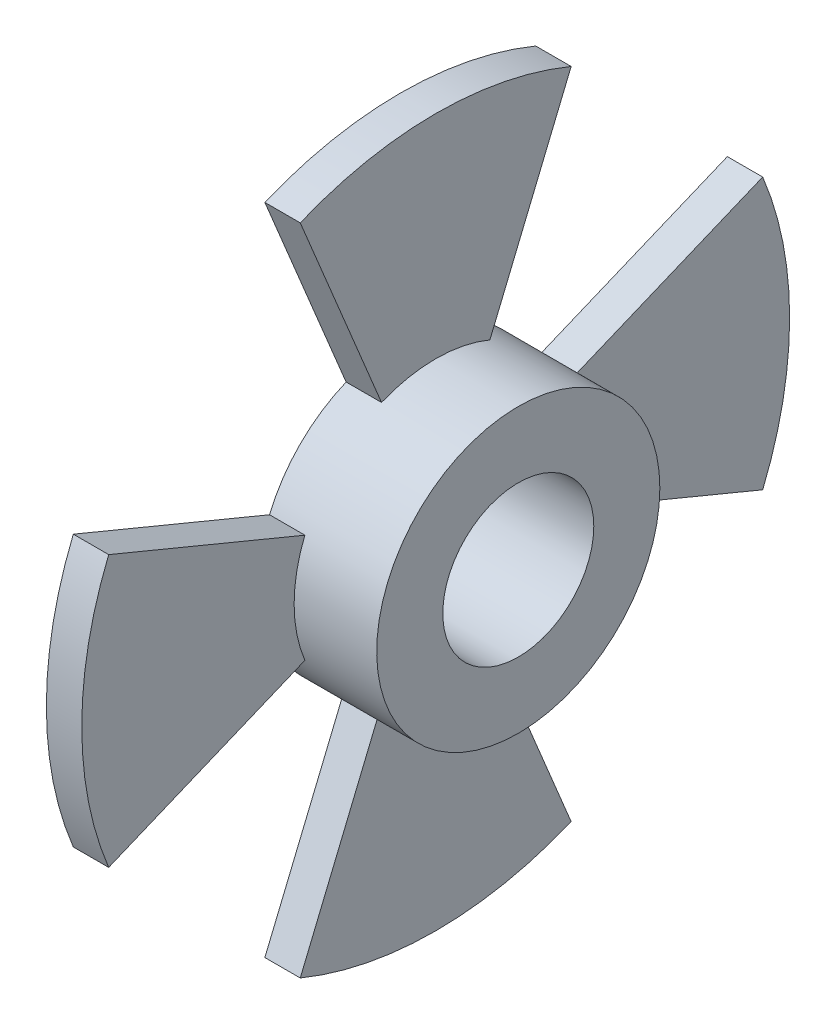
ISO-10303-21;
HEADER;
FILE_DESCRIPTION(('STEP AP214'),'2;1');
FILE_NAME('part.step','',(''),(''),'','','');
FILE_SCHEMA(('AUTOMOTIVE_DESIGN { 1 0 10303 214 1 1 1 1 }'));
ENDSEC;
DATA;
#1=APPLICATION_CONTEXT('core data for automotive mechanical design processes');
#2=APPLICATION_PROTOCOL_DEFINITION('international standard','automotive_design',2000,#1);
#3=PRODUCT_CONTEXT('',#1,'mechanical');
#4=PRODUCT('Part','Part','',(#3));
#5=PRODUCT_RELATED_PRODUCT_CATEGORY('part','',(#4));
#6=PRODUCT_DEFINITION_FORMATION('','',#4);
#7=PRODUCT_DEFINITION_CONTEXT('part definition',#1,'design');
#8=PRODUCT_DEFINITION('design','',#6,#7);
#9=PRODUCT_DEFINITION_SHAPE('','',#8);
#10=(LENGTH_UNIT() NAMED_UNIT(*) SI_UNIT(.MILLI.,.METRE.));
#11=(NAMED_UNIT(*) PLANE_ANGLE_UNIT() SI_UNIT($,.RADIAN.));
#12=(NAMED_UNIT(*) SI_UNIT($,.STERADIAN.) SOLID_ANGLE_UNIT());
#13=UNCERTAINTY_MEASURE_WITH_UNIT(LENGTH_MEASURE(1.E-05),#10,'distance_accuracy_value','');
#14=(GEOMETRIC_REPRESENTATION_CONTEXT(3) GLOBAL_UNCERTAINTY_ASSIGNED_CONTEXT((#13)) GLOBAL_UNIT_ASSIGNED_CONTEXT((#10,
#11,#12)) REPRESENTATION_CONTEXT('',''));
#15=CARTESIAN_POINT('',(0.,0.,0.));
#16=DIRECTION('',(0.,0.,1.));
#17=DIRECTION('',(1.,0.,0.));
#18=AXIS2_PLACEMENT_3D('',#15,#16,#17);
#19=CARTESIAN_POINT('',(0.75,0.,0.));
#20=DIRECTION('',(1.,0.,0.));
#21=DIRECTION('',(0.,0.,-1.));
#22=AXIS2_PLACEMENT_3D('',#19,#20,#21);
#23=PLANE('',#22);
#24=CARTESIAN_POINT('',(0.75,0.,0.));
#25=DIRECTION('',(1.,0.,0.));
#26=DIRECTION('',(0.,0.,-1.));
#27=AXIS2_PLACEMENT_3D('',#24,#25,#26);
#28=CIRCLE('',#27,6.);
#29=CARTESIAN_POINT('',(0.75,5.54327719506774,-2.2961005941905));
#30=VERTEX_POINT('',#29);
#31=CARTESIAN_POINT('',(0.75,5.54327719506771,2.29610059419058));
#32=VERTEX_POINT('',#31);
#33=EDGE_CURVE('E11',#30,#32,#28,.T.);
#34=ORIENTED_EDGE('',*,*,#33,.F.);
#35=DIRECTION('',(0.,-0.923879532511289,0.382683432365084));
#36=VECTOR('',#35,1.);
#37=CARTESIAN_POINT('',(0.75,0.,0.));
#38=LINE('',#37,#36);
#39=CARTESIAN_POINT('',(0.75,13.8581929876693,-5.74025148547626));
#40=VERTEX_POINT('',#39);
#41=EDGE_CURVE('E198',#40,#30,#38,.T.);
#42=ORIENTED_EDGE('',*,*,#41,.F.);
#43=CARTESIAN_POINT('',(0.75,0.,0.));
#44=DIRECTION('',(1.,0.,0.));
#45=DIRECTION('',(0.,0.,-1.));
#46=AXIS2_PLACEMENT_3D('',#43,#44,#45);
#47=CIRCLE('',#46,15.);
#48=CARTESIAN_POINT('',(0.75,13.8581929876693,5.74025148547644));
#49=VERTEX_POINT('',#48);
#50=EDGE_CURVE('E201',#40,#49,#47,.T.);
#51=ORIENTED_EDGE('',*,*,#50,.T.);
#52=DIRECTION('',(0.,-0.923879532511284,-0.382683432365096));
#53=VECTOR('',#52,1.);
#54=CARTESIAN_POINT('',(0.75,0.,0.));
#55=LINE('',#54,#53);
#56=EDGE_CURVE('E203',#49,#32,#55,.T.);
#57=ORIENTED_EDGE('',*,*,#56,.T.);
#58=EDGE_LOOP('',(#34,#42,#51,#57));
#59=FACE_BOUND('',#58,.T.);
#60=ADVANCED_FACE('F37',(#59),#23,.T.);
#61=CARTESIAN_POINT('',(0.75,2.2961005941905,5.54327719506774));
#62=VERTEX_POINT('',#61);
#63=CARTESIAN_POINT('',(0.75,-2.29610059419058,5.54327719506771));
#64=VERTEX_POINT('',#63);
#65=EDGE_CURVE('E47',#62,#64,#28,.T.);
#66=ORIENTED_EDGE('',*,*,#65,.F.);
#67=DIRECTION('',(0.,-0.382683432365084,-0.923879532511289));
#68=VECTOR('',#67,1.);
#69=CARTESIAN_POINT('',(0.75,0.,0.));
#70=LINE('',#69,#68);
#71=CARTESIAN_POINT('',(0.75,5.74025148547625,13.8581929876693));
#72=VERTEX_POINT('',#71);
#73=EDGE_CURVE('E205',#72,#62,#70,.T.);
#74=ORIENTED_EDGE('',*,*,#73,.F.);
#75=CARTESIAN_POINT('',(0.75,0.,0.));
#76=DIRECTION('',(1.,0.,0.));
#77=DIRECTION('',(0.,0.,-1.));
#78=AXIS2_PLACEMENT_3D('',#75,#76,#77);
#79=CIRCLE('',#78,15.);
#80=CARTESIAN_POINT('',(0.75,-5.74025148547644,13.8581929876693));
#81=VERTEX_POINT('',#80);
#82=EDGE_CURVE('E208',#72,#81,#79,.T.);
#83=ORIENTED_EDGE('',*,*,#82,.T.);
#84=DIRECTION('',(0.,0.382683432365096,-0.923879532511284));
#85=VECTOR('',#84,1.);
#86=CARTESIAN_POINT('',(0.75,0.,0.));
#87=LINE('',#86,#85);
#88=EDGE_CURVE('E210',#81,#64,#87,.T.);
#89=ORIENTED_EDGE('',*,*,#88,.T.);
#90=EDGE_LOOP('',(#66,#74,#83,#89));
#91=FACE_BOUND('',#90,.T.);
#92=ADVANCED_FACE('F297',(#91),#23,.T.);
#93=CARTESIAN_POINT('',(0.75,-5.54327719506774,2.2961005941905));
#94=VERTEX_POINT('',#93);
#95=CARTESIAN_POINT('',(0.75,-5.54327719506771,-2.29610059419058));
#96=VERTEX_POINT('',#95);
#97=EDGE_CURVE('E165',#94,#96,#28,.T.);
#98=ORIENTED_EDGE('',*,*,#97,.F.);
#99=DIRECTION('',(0.,0.923879532511289,-0.382683432365084));
#100=VECTOR('',#99,1.);
#101=CARTESIAN_POINT('',(0.75,0.,0.));
#102=LINE('',#101,#100);
#103=CARTESIAN_POINT('',(0.75,-13.8581929876693,5.74025148547626));
#104=VERTEX_POINT('',#103);
#105=EDGE_CURVE('E212',#104,#94,#102,.T.);
#106=ORIENTED_EDGE('',*,*,#105,.F.);
#107=CARTESIAN_POINT('',(0.75,0.,0.));
#108=DIRECTION('',(1.,0.,0.));
#109=DIRECTION('',(0.,0.,-1.));
#110=AXIS2_PLACEMENT_3D('',#107,#108,#109);
#111=CIRCLE('',#110,15.);
#112=CARTESIAN_POINT('',(0.75,-13.8581929876693,-5.74025148547644));
#113=VERTEX_POINT('',#112);
#114=EDGE_CURVE('E168',#104,#113,#111,.T.);
#115=ORIENTED_EDGE('',*,*,#114,.T.);
#116=DIRECTION('',(0.,0.923879532511284,0.382683432365096));
#117=VECTOR('',#116,1.);
#118=CARTESIAN_POINT('',(0.75,0.,0.));
#119=LINE('',#118,#117);
#120=EDGE_CURVE('E160',#113,#96,#119,.T.);
#121=ORIENTED_EDGE('',*,*,#120,.T.);
#122=EDGE_LOOP('',(#98,#106,#115,#121));
#123=FACE_BOUND('',#122,.T.);
#124=ADVANCED_FACE('F162',(#123),#23,.T.);
#125=CARTESIAN_POINT('',(0.75,0.,0.));
#126=DIRECTION('',(-1.,0.,0.));
#127=DIRECTION('',(0.,0.,1.));
#128=AXIS2_PLACEMENT_3D('',#125,#126,#127);
#129=CYLINDRICAL_SURFACE('',#128,15.);
#130=CARTESIAN_POINT('',(-0.75,0.,0.));
#131=DIRECTION('',(1.,0.,0.));
#132=DIRECTION('',(0.,0.,-1.));
#133=AXIS2_PLACEMENT_3D('',#130,#131,#132);
#134=CIRCLE('',#133,15.);
#135=CARTESIAN_POINT('',(-0.75,-5.74025148547626,-13.8581929876693));
#136=VERTEX_POINT('',#135);
#137=CARTESIAN_POINT('',(-0.75,5.74025148547644,-13.8581929876693));
#138=VERTEX_POINT('',#137);
#139=EDGE_CURVE('E216',#136,#138,#134,.T.);
#140=ORIENTED_EDGE('',*,*,#139,.T.);
#141=DIRECTION('',(-1.,0.,0.));
#142=VECTOR('',#141,1.);
#143=CARTESIAN_POINT('',(0.75,5.74025148547644,-13.8581929876693));
#144=LINE('',#143,#142);
#145=CARTESIAN_POINT('',(0.75,5.74025148547644,-13.8581929876693));
#146=VERTEX_POINT('',#145);
#147=EDGE_CURVE('E41',#146,#138,#144,.T.);
#148=ORIENTED_EDGE('',*,*,#147,.F.);
#149=CARTESIAN_POINT('',(0.75,0.,0.));
#150=DIRECTION('',(1.,0.,0.));
#151=DIRECTION('',(0.,0.,-1.));
#152=AXIS2_PLACEMENT_3D('',#149,#150,#151);
#153=CIRCLE('',#152,15.);
#154=CARTESIAN_POINT('',(0.75,-5.74025148547626,-13.8581929876693));
#155=VERTEX_POINT('',#154);
#156=EDGE_CURVE('E194',#155,#146,#153,.T.);
#157=ORIENTED_EDGE('',*,*,#156,.F.);
#158=DIRECTION('',(-1.,0.,0.));
#159=VECTOR('',#158,1.);
#160=CARTESIAN_POINT('',(0.75,-5.74025148547626,-13.8581929876693));
#161=LINE('',#160,#159);
#162=EDGE_CURVE('E57',#155,#136,#161,.T.);
#163=ORIENTED_EDGE('',*,*,#162,.T.);
#164=EDGE_LOOP('',(#140,#148,#157,#163));
#165=FACE_BOUND('',#164,.T.);
#166=ADVANCED_FACE('F39',(#165),#129,.T.);
#167=CARTESIAN_POINT('',(0.75,0.,0.));
#168=DIRECTION('',(0.,-0.923879532511284,-0.382683432365096));
#169=DIRECTION('',(0.,0.382683432365096,-0.923879532511285));
#170=AXIS2_PLACEMENT_3D('',#167,#168,#169);
#171=PLANE('',#170);
#172=DIRECTION('',(0.,-0.382683432365096,0.923879532511284));
#173=VECTOR('',#172,1.);
#174=CARTESIAN_POINT('',(-0.75,0.,0.));
#175=LINE('',#174,#173);
#176=CARTESIAN_POINT('',(-0.75,2.29610059419058,-5.54327719506771));
#177=VERTEX_POINT('',#176);
#178=EDGE_CURVE('E218',#138,#177,#175,.T.);
#179=ORIENTED_EDGE('',*,*,#178,.T.);
#180=DIRECTION('',(-1.,0.,0.));
#181=VECTOR('',#180,1.);
#182=CARTESIAN_POINT('',(0.75,2.29610059419058,-5.54327719506771));
#183=LINE('',#182,#181);
#184=CARTESIAN_POINT('',(0.75,2.29610059419058,-5.54327719506771));
#185=VERTEX_POINT('',#184);
#186=EDGE_CURVE('E276',#185,#177,#183,.T.);
#187=ORIENTED_EDGE('',*,*,#186,.F.);
#188=DIRECTION('',(0.,-0.382683432365096,0.923879532511284));
#189=VECTOR('',#188,1.);
#190=CARTESIAN_POINT('',(0.75,0.,0.));
#191=LINE('',#190,#189);
#192=EDGE_CURVE('E122',#146,#185,#191,.T.);
#193=ORIENTED_EDGE('',*,*,#192,.F.);
#194=ORIENTED_EDGE('',*,*,#147,.T.);
#195=EDGE_LOOP('',(#179,#187,#193,#194));
#196=FACE_BOUND('',#195,.T.);
#197=ADVANCED_FACE('F280',(#196),#171,.F.);
#198=CARTESIAN_POINT('',(0.75,0.,0.));
#199=DIRECTION('',(0.,-0.382683432365084,-0.923879532511289));
#200=DIRECTION('',(0.,0.923879532511289,-0.382683432365084));
#201=AXIS2_PLACEMENT_3D('',#198,#199,#200);
#202=PLANE('',#201);
#203=DIRECTION('',(0.,-0.923879532511289,0.382683432365084));
#204=VECTOR('',#203,1.);
#205=CARTESIAN_POINT('',(-0.75,0.,0.));
#206=LINE('',#205,#204);
#207=CARTESIAN_POINT('',(-0.75,13.8581929876693,-5.74025148547626));
#208=VERTEX_POINT('',#207);
#209=CARTESIAN_POINT('',(-0.75,5.54327719506774,-2.2961005941905));
#210=VERTEX_POINT('',#209);
#211=EDGE_CURVE('E223',#208,#210,#206,.T.);
#212=ORIENTED_EDGE('',*,*,#211,.F.);
#213=DIRECTION('',(-1.,0.,0.));
#214=VECTOR('',#213,1.);
#215=CARTESIAN_POINT('',(0.75,13.8581929876693,-5.74025148547626));
#216=LINE('',#215,#214);
#217=EDGE_CURVE('E273',#40,#208,#216,.T.);
#218=ORIENTED_EDGE('',*,*,#217,.F.);
#219=ORIENTED_EDGE('',*,*,#41,.T.);
#220=DIRECTION('',(-1.,0.,0.));
#221=VECTOR('',#220,1.);
#222=CARTESIAN_POINT('',(0.75,5.54327719506774,-2.2961005941905));
#223=LINE('',#222,#221);
#224=EDGE_CURVE('E275',#30,#210,#223,.T.);
#225=ORIENTED_EDGE('',*,*,#224,.T.);
#226=EDGE_LOOP('',(#212,#218,#219,#225));
#227=FACE_BOUND('',#226,.T.);
#228=ADVANCED_FACE('F319',(#227),#202,.T.);
#229=CARTESIAN_POINT('',(0.75,0.,0.));
#230=DIRECTION('',(-1.,0.,0.));
#231=DIRECTION('',(0.,0.,1.));
#232=AXIS2_PLACEMENT_3D('',#229,#230,#231);
#233=CYLINDRICAL_SURFACE('',#232,15.);
#234=CARTESIAN_POINT('',(-0.75,0.,0.));
#235=DIRECTION('',(1.,0.,0.));
#236=DIRECTION('',(0.,0.,-1.));
#237=AXIS2_PLACEMENT_3D('',#234,#235,#236);
#238=CIRCLE('',#237,15.);
#239=CARTESIAN_POINT('',(-0.75,13.8581929876693,5.74025148547644));
#240=VERTEX_POINT('',#239);
#241=EDGE_CURVE('E228',#208,#240,#238,.T.);
#242=ORIENTED_EDGE('',*,*,#241,.T.);
#243=DIRECTION('',(-1.,0.,0.));
#244=VECTOR('',#243,1.);
#245=CARTESIAN_POINT('',(0.75,13.8581929876693,5.74025148547644));
#246=LINE('',#245,#244);
#247=EDGE_CURVE('E270',#49,#240,#246,.T.);
#248=ORIENTED_EDGE('',*,*,#247,.F.);
#249=ORIENTED_EDGE('',*,*,#50,.F.);
#250=ORIENTED_EDGE('',*,*,#217,.T.);
#251=EDGE_LOOP('',(#242,#248,#249,#250));
#252=FACE_BOUND('',#251,.T.);
#253=ADVANCED_FACE('F323',(#252),#233,.T.);
#254=CARTESIAN_POINT('',(0.75,0.,0.));
#255=DIRECTION('',(0.,0.382683432365096,-0.923879532511284));
#256=DIRECTION('',(0.,0.923879532511284,0.382683432365096));
#257=AXIS2_PLACEMENT_3D('',#254,#255,#256);
#258=PLANE('',#257);
#259=DIRECTION('',(0.,-0.923879532511284,-0.382683432365096));
#260=VECTOR('',#259,1.);
#261=CARTESIAN_POINT('',(-0.75,0.,0.));
#262=LINE('',#261,#260);
#263=CARTESIAN_POINT('',(-0.75,5.54327719506771,2.29610059419058));
#264=VERTEX_POINT('',#263);
#265=EDGE_CURVE('E230',#240,#264,#262,.T.);
#266=ORIENTED_EDGE('',*,*,#265,.T.);
#267=DIRECTION('',(-1.,0.,0.));
#268=VECTOR('',#267,1.);
#269=CARTESIAN_POINT('',(0.75,5.54327719506771,2.29610059419058));
#270=LINE('',#269,#268);
#271=EDGE_CURVE('E267',#32,#264,#270,.T.);
#272=ORIENTED_EDGE('',*,*,#271,.F.);
#273=ORIENTED_EDGE('',*,*,#56,.F.);
#274=ORIENTED_EDGE('',*,*,#247,.T.);
#275=EDGE_LOOP('',(#266,#272,#273,#274));
#276=FACE_BOUND('',#275,.T.);
#277=ADVANCED_FACE('F329',(#276),#258,.F.);
#278=CARTESIAN_POINT('',(0.75,0.,0.));
#279=DIRECTION('',(0.,0.923879532511289,-0.382683432365084));
#280=DIRECTION('',(0.,0.382683432365084,0.923879532511289));
#281=AXIS2_PLACEMENT_3D('',#278,#279,#280);
#282=PLANE('',#281);
#283=DIRECTION('',(0.,-0.382683432365084,-0.923879532511289));
#284=VECTOR('',#283,1.);
#285=CARTESIAN_POINT('',(-0.75,0.,0.));
#286=LINE('',#285,#284);
#287=CARTESIAN_POINT('',(-0.75,5.74025148547625,13.8581929876693));
#288=VERTEX_POINT('',#287);
#289=CARTESIAN_POINT('',(-0.75,2.2961005941905,5.54327719506774));
#290=VERTEX_POINT('',#289);
#291=EDGE_CURVE('E232',#288,#290,#286,.T.);
#292=ORIENTED_EDGE('',*,*,#291,.F.);
#293=DIRECTION('',(-1.,0.,0.));
#294=VECTOR('',#293,1.);
#295=CARTESIAN_POINT('',(0.75,5.74025148547625,13.8581929876693));
#296=LINE('',#295,#294);
#297=EDGE_CURVE('E263',#72,#288,#296,.T.);
#298=ORIENTED_EDGE('',*,*,#297,.F.);
#299=ORIENTED_EDGE('',*,*,#73,.T.);
#300=DIRECTION('',(-1.,0.,0.));
#301=VECTOR('',#300,1.);
#302=CARTESIAN_POINT('',(0.75,2.2961005941905,5.54327719506774));
#303=LINE('',#302,#301);
#304=EDGE_CURVE('E265',#62,#290,#303,.T.);
#305=ORIENTED_EDGE('',*,*,#304,.T.);
#306=EDGE_LOOP('',(#292,#298,#299,#305));
#307=FACE_BOUND('',#306,.T.);
#308=ADVANCED_FACE('F333',(#307),#282,.T.);
#309=CARTESIAN_POINT('',(0.75,0.,0.));
#310=DIRECTION('',(-1.,0.,0.));
#311=DIRECTION('',(0.,0.,1.));
#312=AXIS2_PLACEMENT_3D('',#309,#310,#311);
#313=CYLINDRICAL_SURFACE('',#312,15.);
#314=CARTESIAN_POINT('',(-0.75,0.,0.));
#315=DIRECTION('',(1.,0.,0.));
#316=DIRECTION('',(0.,0.,-1.));
#317=AXIS2_PLACEMENT_3D('',#314,#315,#316);
#318=CIRCLE('',#317,15.);
#319=CARTESIAN_POINT('',(-0.75,-5.74025148547644,13.8581929876693));
#320=VERTEX_POINT('',#319);
#321=EDGE_CURVE('E235',#288,#320,#318,.T.);
#322=ORIENTED_EDGE('',*,*,#321,.T.);
#323=DIRECTION('',(-1.,0.,0.));
#324=VECTOR('',#323,1.);
#325=CARTESIAN_POINT('',(0.75,-5.74025148547644,13.8581929876693));
#326=LINE('',#325,#324);
#327=EDGE_CURVE('E260',#81,#320,#326,.T.);
#328=ORIENTED_EDGE('',*,*,#327,.F.);
#329=ORIENTED_EDGE('',*,*,#82,.F.);
#330=ORIENTED_EDGE('',*,*,#297,.T.);
#331=EDGE_LOOP('',(#322,#328,#329,#330));
#332=FACE_BOUND('',#331,.T.);
#333=ADVANCED_FACE('F337',(#332),#313,.T.);
#334=CARTESIAN_POINT('',(0.75,0.,0.));
#335=DIRECTION('',(0.,0.923879532511284,0.382683432365096));
#336=DIRECTION('',(0.,-0.382683432365096,0.923879532511285));
#337=AXIS2_PLACEMENT_3D('',#334,#335,#336);
#338=PLANE('',#337);
#339=DIRECTION('',(0.,0.382683432365096,-0.923879532511284));
#340=VECTOR('',#339,1.);
#341=CARTESIAN_POINT('',(-0.75,0.,0.));
#342=LINE('',#341,#340);
#343=CARTESIAN_POINT('',(-0.75,-2.29610059419058,5.54327719506771));
#344=VERTEX_POINT('',#343);
#345=EDGE_CURVE('E237',#320,#344,#342,.T.);
#346=ORIENTED_EDGE('',*,*,#345,.T.);
#347=DIRECTION('',(-1.,0.,0.));
#348=VECTOR('',#347,1.);
#349=CARTESIAN_POINT('',(0.75,-2.29610059419058,5.54327719506771));
#350=LINE('',#349,#348);
#351=EDGE_CURVE('E257',#64,#344,#350,.T.);
#352=ORIENTED_EDGE('',*,*,#351,.F.);
#353=ORIENTED_EDGE('',*,*,#88,.F.);
#354=ORIENTED_EDGE('',*,*,#327,.T.);
#355=EDGE_LOOP('',(#346,#352,#353,#354));
#356=FACE_BOUND('',#355,.T.);
#357=ADVANCED_FACE('F341',(#356),#338,.F.);
#358=CARTESIAN_POINT('',(0.75,0.,0.));
#359=DIRECTION('',(0.,0.382683432365084,0.923879532511289));
#360=DIRECTION('',(0.,-0.923879532511289,0.382683432365084));
#361=AXIS2_PLACEMENT_3D('',#358,#359,#360);
#362=PLANE('',#361);
#363=DIRECTION('',(0.,0.923879532511289,-0.382683432365084));
#364=VECTOR('',#363,1.);
#365=CARTESIAN_POINT('',(-0.75,0.,0.));
#366=LINE('',#365,#364);
#367=CARTESIAN_POINT('',(-0.75,-13.8581929876693,5.74025148547626));
#368=VERTEX_POINT('',#367);
#369=CARTESIAN_POINT('',(-0.75,-5.54327719506774,2.2961005941905));
#370=VERTEX_POINT('',#369);
#371=EDGE_CURVE('E240',#368,#370,#366,.T.);
#372=ORIENTED_EDGE('',*,*,#371,.F.);
#373=DIRECTION('',(-1.,0.,0.));
#374=VECTOR('',#373,1.);
#375=CARTESIAN_POINT('',(0.75,-13.8581929876693,5.74025148547626));
#376=LINE('',#375,#374);
#377=EDGE_CURVE('E254',#104,#368,#376,.T.);
#378=ORIENTED_EDGE('',*,*,#377,.F.);
#379=ORIENTED_EDGE('',*,*,#105,.T.);
#380=DIRECTION('',(-1.,0.,0.));
#381=VECTOR('',#380,1.);
#382=CARTESIAN_POINT('',(0.75,-5.54327719506774,2.2961005941905));
#383=LINE('',#382,#381);
#384=EDGE_CURVE('E186',#94,#370,#383,.T.);
#385=ORIENTED_EDGE('',*,*,#384,.T.);
#386=EDGE_LOOP('',(#372,#378,#379,#385));
#387=FACE_BOUND('',#386,.T.);
#388=ADVANCED_FACE('F345',(#387),#362,.T.);
#389=CARTESIAN_POINT('',(0.75,0.,0.));
#390=DIRECTION('',(-1.,0.,0.));
#391=DIRECTION('',(0.,0.,1.));
#392=AXIS2_PLACEMENT_3D('',#389,#390,#391);
#393=CYLINDRICAL_SURFACE('',#392,15.);
#394=CARTESIAN_POINT('',(-0.75,0.,0.));
#395=DIRECTION('',(1.,0.,0.));
#396=DIRECTION('',(0.,0.,-1.));
#397=AXIS2_PLACEMENT_3D('',#394,#395,#396);
#398=CIRCLE('',#397,15.);
#399=CARTESIAN_POINT('',(-0.75,-13.8581929876693,-5.74025148547644));
#400=VERTEX_POINT('',#399);
#401=EDGE_CURVE('E243',#368,#400,#398,.T.);
#402=ORIENTED_EDGE('',*,*,#401,.T.);
#403=DIRECTION('',(-1.,0.,0.));
#404=VECTOR('',#403,1.);
#405=CARTESIAN_POINT('',(0.75,-13.8581929876693,-5.74025148547644));
#406=LINE('',#405,#404);
#407=EDGE_CURVE('E181',#113,#400,#406,.T.);
#408=ORIENTED_EDGE('',*,*,#407,.F.);
#409=ORIENTED_EDGE('',*,*,#114,.F.);
#410=ORIENTED_EDGE('',*,*,#377,.T.);
#411=EDGE_LOOP('',(#402,#408,#409,#410));
#412=FACE_BOUND('',#411,.T.);
#413=ADVANCED_FACE('F349',(#412),#393,.T.);
#414=CARTESIAN_POINT('',(0.75,0.,0.));
#415=DIRECTION('',(0.,-0.382683432365096,0.923879532511284));
#416=DIRECTION('',(0.,-0.923879532511285,-0.382683432365096));
#417=AXIS2_PLACEMENT_3D('',#414,#415,#416);
#418=PLANE('',#417);
#419=DIRECTION('',(0.,0.923879532511284,0.382683432365096));
#420=VECTOR('',#419,1.);
#421=CARTESIAN_POINT('',(-0.75,0.,0.));
#422=LINE('',#421,#420);
#423=CARTESIAN_POINT('',(-0.75,-5.54327719506771,-2.29610059419058));
#424=VERTEX_POINT('',#423);
#425=EDGE_CURVE('E178',#400,#424,#422,.T.);
#426=ORIENTED_EDGE('',*,*,#425,.T.);
#427=DIRECTION('',(-1.,0.,0.));
#428=VECTOR('',#427,1.);
#429=CARTESIAN_POINT('',(0.75,-5.54327719506771,-2.29610059419058));
#430=LINE('',#429,#428);
#431=EDGE_CURVE('E175',#96,#424,#430,.T.);
#432=ORIENTED_EDGE('',*,*,#431,.F.);
#433=ORIENTED_EDGE('',*,*,#120,.F.);
#434=ORIENTED_EDGE('',*,*,#407,.T.);
#435=EDGE_LOOP('',(#426,#432,#433,#434));
#436=FACE_BOUND('',#435,.T.);
#437=ADVANCED_FACE('F176',(#436),#418,.F.);
#438=CARTESIAN_POINT('',(0.75,0.,0.));
#439=DIRECTION('',(-1.,0.,0.));
#440=DIRECTION('',(0.,0.,1.));
#441=AXIS2_PLACEMENT_3D('',#438,#439,#440);
#442=CYLINDRICAL_SURFACE('',#441,6.);
#443=CARTESIAN_POINT('',(-0.75,0.,0.));
#444=DIRECTION('',(1.,0.,0.));
#445=DIRECTION('',(0.,0.,-1.));
#446=AXIS2_PLACEMENT_3D('',#443,#444,#445);
#447=CIRCLE('',#446,6.);
#448=CARTESIAN_POINT('',(-0.75,-2.2961005941905,-5.54327719506774));
#449=VERTEX_POINT('',#448);
#450=EDGE_CURVE('E224',#424,#449,#447,.T.);
#451=ORIENTED_EDGE('',*,*,#450,.T.);
#452=DIRECTION('',(-1.,0.,0.));
#453=VECTOR('',#452,1.);
#454=CARTESIAN_POINT('',(0.75,-2.2961005941905,-5.54327719506774));
#455=LINE('',#454,#453);
#456=CARTESIAN_POINT('',(0.75,-2.2961005941905,-5.54327719506774));
#457=VERTEX_POINT('',#456);
#458=EDGE_CURVE('E109',#457,#449,#455,.T.);
#459=ORIENTED_EDGE('',*,*,#458,.F.);
#460=EDGE_CURVE('E49',#457,#185,#28,.T.);
#461=ORIENTED_EDGE('',*,*,#460,.T.);
#462=ORIENTED_EDGE('',*,*,#186,.T.);
#463=EDGE_CURVE('E220',#177,#210,#447,.T.);
#464=ORIENTED_EDGE('',*,*,#463,.T.);
#465=ORIENTED_EDGE('',*,*,#224,.F.);
#466=ORIENTED_EDGE('',*,*,#33,.T.);
#467=ORIENTED_EDGE('',*,*,#271,.T.);
#468=EDGE_CURVE('E225',#264,#290,#447,.T.);
#469=ORIENTED_EDGE('',*,*,#468,.T.);
#470=ORIENTED_EDGE('',*,*,#304,.F.);
#471=ORIENTED_EDGE('',*,*,#65,.T.);
#472=ORIENTED_EDGE('',*,*,#351,.T.);
#473=EDGE_CURVE('E239',#344,#370,#447,.T.);
#474=ORIENTED_EDGE('',*,*,#473,.T.);
#475=ORIENTED_EDGE('',*,*,#384,.F.);
#476=ORIENTED_EDGE('',*,*,#97,.T.);
#477=ORIENTED_EDGE('',*,*,#431,.T.);
#478=EDGE_LOOP('',(#451,#459,#461,#462,#464,#465,#466,#467,#469,#470,#471,#472,#474,#475,#476,#477));
#479=FACE_BOUND('',#478,.T.);
#480=CARTESIAN_POINT('',(4.25,0.,0.));
#481=DIRECTION('',(1.,0.,0.));
#482=DIRECTION('',(0.,0.,-1.));
#483=AXIS2_PLACEMENT_3D('',#480,#481,#482);
#484=CIRCLE('',#483,6.);
#485=CARTESIAN_POINT('',(4.25,0.,-6.));
#486=VERTEX_POINT('',#485);
#487=EDGE_CURVE('E192',#486,#486,#484,.T.);
#488=ORIENTED_EDGE('',*,*,#487,.F.);
#489=EDGE_LOOP('',(#488));
#490=FACE_BOUND('',#489,.T.);
#491=ADVANCED_FACE('F183',(#479,#490),#442,.T.);
#492=CARTESIAN_POINT('',(0.75,0.,0.));
#493=DIRECTION('',(0.,-0.923879532511289,0.382683432365084));
#494=DIRECTION('',(0.,-0.382683432365084,-0.923879532511289));
#495=AXIS2_PLACEMENT_3D('',#492,#493,#494);
#496=PLANE('',#495);
#497=DIRECTION('',(0.,0.382683432365084,0.923879532511289));
#498=VECTOR('',#497,1.);
#499=CARTESIAN_POINT('',(-0.75,0.,0.));
#500=LINE('',#499,#498);
#501=EDGE_CURVE('E246',#136,#449,#500,.T.);
#502=ORIENTED_EDGE('',*,*,#501,.F.);
#503=ORIENTED_EDGE('',*,*,#162,.F.);
#504=DIRECTION('',(0.,0.382683432365084,0.923879532511289));
#505=VECTOR('',#504,1.);
#506=CARTESIAN_POINT('',(0.75,0.,0.));
#507=LINE('',#506,#505);
#508=EDGE_CURVE('E172',#155,#457,#507,.T.);
#509=ORIENTED_EDGE('',*,*,#508,.T.);
#510=ORIENTED_EDGE('',*,*,#458,.T.);
#511=EDGE_LOOP('',(#502,#503,#509,#510));
#512=FACE_BOUND('',#511,.T.);
#513=ADVANCED_FACE('F284',(#512),#496,.T.);
#514=CARTESIAN_POINT('',(0.75,0.,0.));
#515=DIRECTION('',(-1.,0.,0.));
#516=DIRECTION('',(0.,0.,1.));
#517=AXIS2_PLACEMENT_3D('',#514,#515,#516);
#518=CYLINDRICAL_SURFACE('',#517,3.2);
#519=CARTESIAN_POINT('',(-0.75,0.,0.));
#520=DIRECTION('',(1.,0.,0.));
#521=DIRECTION('',(0.,0.,-1.));
#522=AXIS2_PLACEMENT_3D('',#519,#520,#521);
#523=CIRCLE('',#522,3.2);
#524=CARTESIAN_POINT('',(-0.75,0.,-3.2));
#525=VERTEX_POINT('',#524);
#526=EDGE_CURVE('E196',#525,#525,#523,.T.);
#527=ORIENTED_EDGE('',*,*,#526,.F.);
#528=EDGE_LOOP('',(#527));
#529=FACE_BOUND('',#528,.T.);
#530=CARTESIAN_POINT('',(4.25,0.,0.));
#531=DIRECTION('',(1.,0.,0.));
#532=DIRECTION('',(0.,0.,-1.));
#533=AXIS2_PLACEMENT_3D('',#530,#531,#532);
#534=CIRCLE('',#533,3.2);
#535=CARTESIAN_POINT('',(4.25,0.,-3.2));
#536=VERTEX_POINT('',#535);
#537=EDGE_CURVE('E688',#536,#536,#534,.T.);
#538=ORIENTED_EDGE('',*,*,#537,.T.);
#539=EDGE_LOOP('',(#538));
#540=FACE_BOUND('',#539,.T.);
#541=ADVANCED_FACE('F286',(#529,#540),#518,.F.);
#542=ORIENTED_EDGE('',*,*,#460,.F.);
#543=ORIENTED_EDGE('',*,*,#508,.F.);
#544=ORIENTED_EDGE('',*,*,#156,.T.);
#545=ORIENTED_EDGE('',*,*,#192,.T.);
#546=EDGE_LOOP('',(#542,#543,#544,#545));
#547=FACE_BOUND('',#546,.T.);
#548=ADVANCED_FACE('F292',(#547),#23,.T.);
#549=CARTESIAN_POINT('',(-0.75,0.,0.));
#550=DIRECTION('',(1.,0.,0.));
#551=DIRECTION('',(0.,0.,-1.));
#552=AXIS2_PLACEMENT_3D('',#549,#550,#551);
#553=PLANE('',#552);
#554=ORIENTED_EDGE('',*,*,#139,.F.);
#555=ORIENTED_EDGE('',*,*,#501,.T.);
#556=ORIENTED_EDGE('',*,*,#450,.F.);
#557=ORIENTED_EDGE('',*,*,#425,.F.);
#558=ORIENTED_EDGE('',*,*,#401,.F.);
#559=ORIENTED_EDGE('',*,*,#371,.T.);
#560=ORIENTED_EDGE('',*,*,#473,.F.);
#561=ORIENTED_EDGE('',*,*,#345,.F.);
#562=ORIENTED_EDGE('',*,*,#321,.F.);
#563=ORIENTED_EDGE('',*,*,#291,.T.);
#564=ORIENTED_EDGE('',*,*,#468,.F.);
#565=ORIENTED_EDGE('',*,*,#265,.F.);
#566=ORIENTED_EDGE('',*,*,#241,.F.);
#567=ORIENTED_EDGE('',*,*,#211,.T.);
#568=ORIENTED_EDGE('',*,*,#463,.F.);
#569=ORIENTED_EDGE('',*,*,#178,.F.);
#570=EDGE_LOOP('',(#554,#555,#556,#557,#558,#559,#560,#561,#562,#563,#564,#565,#566,#567,#568,#569));
#571=FACE_BOUND('',#570,.T.);
#572=ORIENTED_EDGE('',*,*,#526,.T.);
#573=EDGE_LOOP('',(#572));
#574=FACE_BOUND('',#573,.T.);
#575=ADVANCED_FACE('F282',(#571,#574),#553,.F.);
#576=CARTESIAN_POINT('',(4.25,0.,0.));
#577=DIRECTION('',(1.,0.,0.));
#578=DIRECTION('',(0.,0.,-1.));
#579=AXIS2_PLACEMENT_3D('',#576,#577,#578);
#580=PLANE('',#579);
#581=ORIENTED_EDGE('',*,*,#487,.T.);
#582=EDGE_LOOP('',(#581));
#583=FACE_BOUND('',#582,.T.);
#584=ORIENTED_EDGE('',*,*,#537,.F.);
#585=EDGE_LOOP('',(#584));
#586=FACE_BOUND('',#585,.T.);
#587=ADVANCED_FACE('F311',(#583,#586),#580,.T.);
#588=CLOSED_SHELL('',(#60,#92,#124,#166,#197,#228,#253,#277,#308,#333,#357,#388,#413,#437,#491,
#513,#541,#548,#575,#587));
#589=MANIFOLD_SOLID_BREP('B2',#588);
#590=ADVANCED_BREP_SHAPE_REPRESENTATION('',(#18,#589),#14);
#591=SHAPE_DEFINITION_REPRESENTATION(#9,#590);
ENDSEC;
END-ISO-10303-21;
